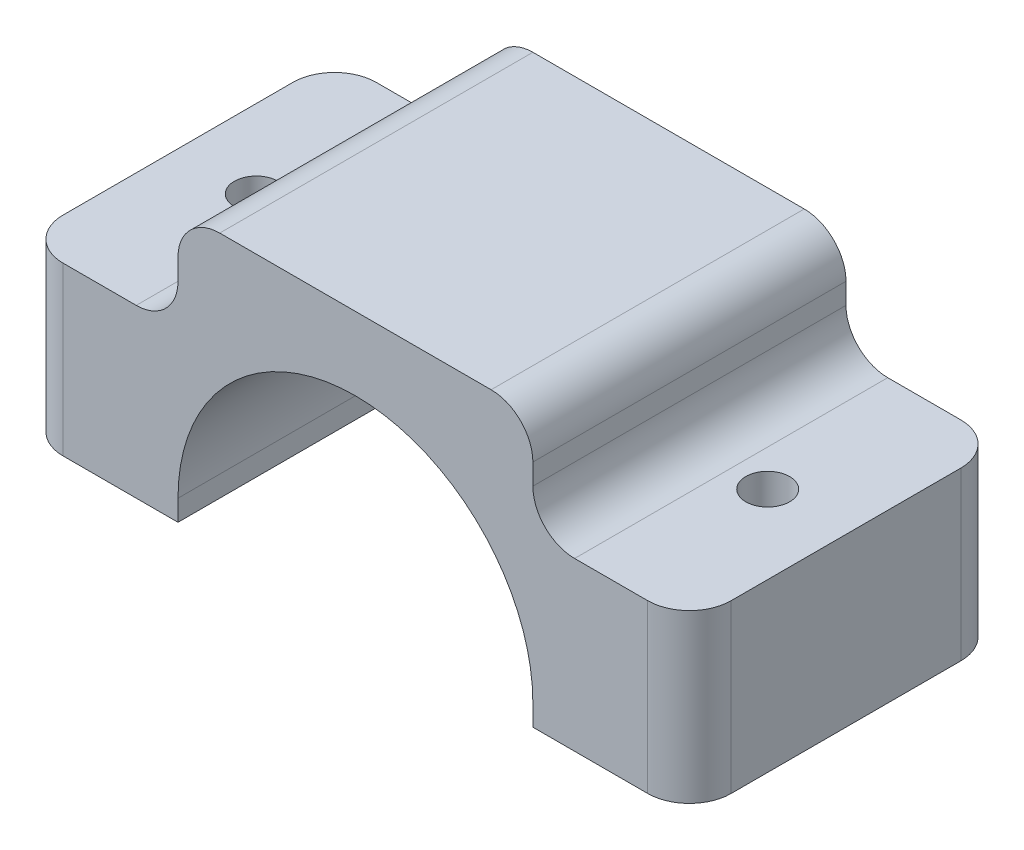
ISO-10303-21;
HEADER;
FILE_DESCRIPTION(('STEP AP214'),'2;1');
FILE_NAME('part.step','',(''),(''),'','','');
FILE_SCHEMA(('AUTOMOTIVE_DESIGN { 1 0 10303 214 1 1 1 1 }'));
ENDSEC;
DATA;
#1=APPLICATION_CONTEXT('core data for automotive mechanical design processes');
#2=APPLICATION_PROTOCOL_DEFINITION('international standard','automotive_design',2000,#1);
#3=PRODUCT_CONTEXT('',#1,'mechanical');
#4=PRODUCT('Part','Part','',(#3));
#5=PRODUCT_RELATED_PRODUCT_CATEGORY('part','',(#4));
#6=PRODUCT_DEFINITION_FORMATION('','',#4);
#7=PRODUCT_DEFINITION_CONTEXT('part definition',#1,'design');
#8=PRODUCT_DEFINITION('design','',#6,#7);
#9=PRODUCT_DEFINITION_SHAPE('','',#8);
#10=(LENGTH_UNIT() NAMED_UNIT(*) SI_UNIT(.MILLI.,.METRE.));
#11=(NAMED_UNIT(*) PLANE_ANGLE_UNIT() SI_UNIT($,.RADIAN.));
#12=(NAMED_UNIT(*) SI_UNIT($,.STERADIAN.) SOLID_ANGLE_UNIT());
#13=UNCERTAINTY_MEASURE_WITH_UNIT(LENGTH_MEASURE(1.E-05),#10,'distance_accuracy_value','');
#14=(GEOMETRIC_REPRESENTATION_CONTEXT(3) GLOBAL_UNCERTAINTY_ASSIGNED_CONTEXT((#13)) GLOBAL_UNIT_ASSIGNED_CONTEXT((#10,
#11,#12)) REPRESENTATION_CONTEXT('',''));
#15=CARTESIAN_POINT('',(0.,0.,0.));
#16=DIRECTION('',(0.,0.,1.));
#17=DIRECTION('',(1.,0.,0.));
#18=AXIS2_PLACEMENT_3D('',#15,#16,#17);
#19=CARTESIAN_POINT('',(0.,12.,15.));
#20=DIRECTION('',(0.,-1.,0.));
#21=DIRECTION('',(1.,0.,0.));
#22=AXIS2_PLACEMENT_3D('',#19,#20,#21);
#23=PLANE('',#22);
#24=DIRECTION('',(-1.,0.,0.));
#25=VECTOR('',#24,1.);
#26=CARTESIAN_POINT('',(0.,12.,15.));
#27=LINE('',#26,#25);
#28=CARTESIAN_POINT('',(6.5,12.,15.));
#29=VERTEX_POINT('',#28);
#30=CARTESIAN_POINT('',(-6.5,12.,15.));
#31=VERTEX_POINT('',#30);
#32=EDGE_CURVE('E283',#29,#31,#27,.T.);
#33=ORIENTED_EDGE('',*,*,#32,.F.);
#34=DIRECTION('',(0.,0.,-1.));
#35=VECTOR('',#34,1.);
#36=CARTESIAN_POINT('',(6.5,12.,0.));
#37=LINE('',#36,#35);
#38=CARTESIAN_POINT('',(6.5,12.,0.));
#39=VERTEX_POINT('',#38);
#40=EDGE_CURVE('E324',#29,#39,#37,.T.);
#41=ORIENTED_EDGE('',*,*,#40,.T.);
#42=DIRECTION('',(-1.,0.,0.));
#43=VECTOR('',#42,1.);
#44=CARTESIAN_POINT('',(0.,12.,0.));
#45=LINE('',#44,#43);
#46=CARTESIAN_POINT('',(-6.5,12.,0.));
#47=VERTEX_POINT('',#46);
#48=EDGE_CURVE('E284',#39,#47,#45,.T.);
#49=ORIENTED_EDGE('',*,*,#48,.T.);
#50=DIRECTION('',(0.,0.,1.));
#51=VECTOR('',#50,1.);
#52=CARTESIAN_POINT('',(-6.5,12.,15.));
#53=LINE('',#52,#51);
#54=EDGE_CURVE('E321',#47,#31,#53,.T.);
#55=ORIENTED_EDGE('',*,*,#54,.T.);
#56=EDGE_LOOP('',(#33,#41,#49,#55));
#57=FACE_BOUND('',#56,.T.);
#58=ADVANCED_FACE('F37',(#57),#23,.F.);
#59=CARTESIAN_POINT('',(0.,0.,15.));
#60=DIRECTION('',(0.,0.,-1.));
#61=DIRECTION('',(-1.,0.,0.));
#62=AXIS2_PLACEMENT_3D('',#59,#60,#61);
#63=CYLINDRICAL_SURFACE('',#62,8.5);
#64=CARTESIAN_POINT('',(0.,0.,0.));
#65=DIRECTION('',(0.,0.,1.));
#66=DIRECTION('',(1.,0.,0.));
#67=AXIS2_PLACEMENT_3D('',#64,#65,#66);
#68=CIRCLE('',#67,8.5);
#69=CARTESIAN_POINT('',(8.5,0.,0.));
#70=VERTEX_POINT('',#69);
#71=CARTESIAN_POINT('',(-8.5,0.,0.));
#72=VERTEX_POINT('',#71);
#73=EDGE_CURVE('E280',#70,#72,#68,.T.);
#74=ORIENTED_EDGE('',*,*,#73,.F.);
#75=DIRECTION('',(0.,0.,-1.));
#76=VECTOR('',#75,1.);
#77=CARTESIAN_POINT('',(8.5,0.,15.));
#78=LINE('',#77,#76);
#79=CARTESIAN_POINT('',(8.5,0.,15.));
#80=VERTEX_POINT('',#79);
#81=EDGE_CURVE('E292',#80,#70,#78,.T.);
#82=ORIENTED_EDGE('',*,*,#81,.F.);
#83=CARTESIAN_POINT('',(0.,0.,15.));
#84=DIRECTION('',(0.,0.,1.));
#85=DIRECTION('',(1.,0.,0.));
#86=AXIS2_PLACEMENT_3D('',#83,#84,#85);
#87=CIRCLE('',#86,8.5);
#88=CARTESIAN_POINT('',(-8.5,0.,15.));
#89=VERTEX_POINT('',#88);
#90=EDGE_CURVE('E281',#80,#89,#87,.T.);
#91=ORIENTED_EDGE('',*,*,#90,.T.);
#92=DIRECTION('',(0.,0.,-1.));
#93=VECTOR('',#92,1.);
#94=CARTESIAN_POINT('',(-8.5,0.,15.));
#95=LINE('',#94,#93);
#96=EDGE_CURVE('E286',#89,#72,#95,.T.);
#97=ORIENTED_EDGE('',*,*,#96,.T.);
#98=EDGE_LOOP('',(#74,#82,#91,#97));
#99=FACE_BOUND('',#98,.T.);
#100=ADVANCED_FACE('F390',(#99),#63,.F.);
#101=CARTESIAN_POINT('',(16.,0.,15.));
#102=DIRECTION('',(-1.,0.,0.));
#103=DIRECTION('',(0.,0.,1.));
#104=AXIS2_PLACEMENT_3D('',#101,#102,#103);
#105=PLANE('',#104);
#106=DIRECTION('',(0.,1.,0.));
#107=VECTOR('',#106,1.);
#108=CARTESIAN_POINT('',(16.,0.,2.));
#109=LINE('',#108,#107);
#110=CARTESIAN_POINT('',(16.,-1.00000000000001,2.));
#111=VERTEX_POINT('',#110);
#112=CARTESIAN_POINT('',(16.,7.,2.));
#113=VERTEX_POINT('',#112);
#114=EDGE_CURVE('E175',#111,#113,#109,.T.);
#115=ORIENTED_EDGE('',*,*,#114,.T.);
#116=DIRECTION('',(0.,0.,1.));
#117=VECTOR('',#116,1.);
#118=CARTESIAN_POINT('',(16.,7.,15.));
#119=LINE('',#118,#117);
#120=CARTESIAN_POINT('',(16.,7.,13.));
#121=VERTEX_POINT('',#120);
#122=EDGE_CURVE('E267',#113,#121,#119,.T.);
#123=ORIENTED_EDGE('',*,*,#122,.T.);
#124=DIRECTION('',(0.,1.,0.));
#125=VECTOR('',#124,1.);
#126=CARTESIAN_POINT('',(16.,0.,13.));
#127=LINE('',#126,#125);
#128=CARTESIAN_POINT('',(16.,-1.00000000000001,13.));
#129=VERTEX_POINT('',#128);
#130=EDGE_CURVE('E185',#121,#129,#127,.F.);
#131=ORIENTED_EDGE('',*,*,#130,.T.);
#132=DIRECTION('',(0.,0.,1.));
#133=VECTOR('',#132,1.);
#134=CARTESIAN_POINT('',(16.,-1.00000000000001,2.));
#135=LINE('',#134,#133);
#136=EDGE_CURVE('E189',#111,#129,#135,.T.);
#137=ORIENTED_EDGE('',*,*,#136,.F.);
#138=EDGE_LOOP('',(#115,#123,#131,#137));
#139=FACE_BOUND('',#138,.T.);
#140=ADVANCED_FACE('F190',(#139),#105,.F.);
#141=CARTESIAN_POINT('',(-16.,0.,15.));
#142=DIRECTION('',(-1.,0.,0.));
#143=DIRECTION('',(0.,0.,1.));
#144=AXIS2_PLACEMENT_3D('',#141,#142,#143);
#145=PLANE('',#144);
#146=DIRECTION('',(0.,0.,-1.));
#147=VECTOR('',#146,1.);
#148=CARTESIAN_POINT('',(-16.,6.99999999999999,15.));
#149=LINE('',#148,#147);
#150=CARTESIAN_POINT('',(-16.,6.99999999999999,13.));
#151=VERTEX_POINT('',#150);
#152=CARTESIAN_POINT('',(-16.,6.99999999999999,2.));
#153=VERTEX_POINT('',#152);
#154=EDGE_CURVE('E248',#151,#153,#149,.T.);
#155=ORIENTED_EDGE('',*,*,#154,.T.);
#156=DIRECTION('',(0.,1.,0.));
#157=VECTOR('',#156,1.);
#158=CARTESIAN_POINT('',(-16.,0.,2.));
#159=LINE('',#158,#157);
#160=CARTESIAN_POINT('',(-16.,-0.999999999999992,2.));
#161=VERTEX_POINT('',#160);
#162=EDGE_CURVE('E303',#153,#161,#159,.F.);
#163=ORIENTED_EDGE('',*,*,#162,.T.);
#164=DIRECTION('',(0.,0.,-1.));
#165=VECTOR('',#164,1.);
#166=CARTESIAN_POINT('',(-16.,-0.999999999999992,13.));
#167=LINE('',#166,#165);
#168=CARTESIAN_POINT('',(-16.,-0.999999999999992,13.));
#169=VERTEX_POINT('',#168);
#170=EDGE_CURVE('E225',#169,#161,#167,.T.);
#171=ORIENTED_EDGE('',*,*,#170,.F.);
#172=DIRECTION('',(0.,1.,0.));
#173=VECTOR('',#172,1.);
#174=CARTESIAN_POINT('',(-16.,0.,13.));
#175=LINE('',#174,#173);
#176=EDGE_CURVE('E300',#169,#151,#175,.T.);
#177=ORIENTED_EDGE('',*,*,#176,.T.);
#178=EDGE_LOOP('',(#155,#163,#171,#177));
#179=FACE_BOUND('',#178,.T.);
#180=ADVANCED_FACE('F409',(#179),#145,.T.);
#181=CARTESIAN_POINT('',(0.,0.,15.));
#182=DIRECTION('',(0.,0.,1.));
#183=DIRECTION('',(1.,0.,0.));
#184=AXIS2_PLACEMENT_3D('',#181,#182,#183);
#185=PLANE('',#184);
#186=DIRECTION('',(0.,1.,0.));
#187=VECTOR('',#186,1.);
#188=CARTESIAN_POINT('',(8.5,7.,15.));
#189=LINE('',#188,#187);
#190=CARTESIAN_POINT('',(8.5,9.,15.));
#191=VERTEX_POINT('',#190);
#192=CARTESIAN_POINT('',(8.5,9.99999999999999,15.));
#193=VERTEX_POINT('',#192);
#194=EDGE_CURVE('E272',#191,#193,#189,.T.);
#195=ORIENTED_EDGE('',*,*,#194,.T.);
#196=CARTESIAN_POINT('',(6.5,9.99999999999999,15.));
#197=DIRECTION('',(0.,0.,1.));
#198=DIRECTION('',(1.,0.,0.));
#199=AXIS2_PLACEMENT_3D('',#196,#197,#198);
#200=CIRCLE('',#199,2.);
#201=EDGE_CURVE('E332',#193,#29,#200,.T.);
#202=ORIENTED_EDGE('',*,*,#201,.T.);
#203=ORIENTED_EDGE('',*,*,#32,.T.);
#204=CARTESIAN_POINT('',(-6.5,9.99999999999999,15.));
#205=DIRECTION('',(0.,0.,1.));
#206=DIRECTION('',(1.,0.,0.));
#207=AXIS2_PLACEMENT_3D('',#204,#205,#206);
#208=CIRCLE('',#207,2.);
#209=CARTESIAN_POINT('',(-8.5,9.99999999999999,15.));
#210=VERTEX_POINT('',#209);
#211=EDGE_CURVE('E52',#31,#210,#208,.T.);
#212=ORIENTED_EDGE('',*,*,#211,.T.);
#213=DIRECTION('',(0.,1.,0.));
#214=VECTOR('',#213,1.);
#215=CARTESIAN_POINT('',(-8.5,6.99999999999999,15.));
#216=LINE('',#215,#214);
#217=CARTESIAN_POINT('',(-8.5,8.99999999999999,15.));
#218=VERTEX_POINT('',#217);
#219=EDGE_CURVE('E257',#218,#210,#216,.T.);
#220=ORIENTED_EDGE('',*,*,#219,.F.);
#221=CARTESIAN_POINT('',(-10.5,8.99999999999999,15.));
#222=DIRECTION('',(0.,0.,1.));
#223=DIRECTION('',(1.,0.,0.));
#224=AXIS2_PLACEMENT_3D('',#221,#222,#223);
#225=CIRCLE('',#224,2.);
#226=CARTESIAN_POINT('',(-10.5,6.99999999999999,15.));
#227=VERTEX_POINT('',#226);
#228=EDGE_CURVE('E45',#218,#227,#225,.F.);
#229=ORIENTED_EDGE('',*,*,#228,.T.);
#230=DIRECTION('',(-1.,0.,0.));
#231=VECTOR('',#230,1.);
#232=CARTESIAN_POINT('',(0.,6.99999999999999,15.));
#233=LINE('',#232,#231);
#234=CARTESIAN_POINT('',(-14.,6.99999999999999,15.));
#235=VERTEX_POINT('',#234);
#236=EDGE_CURVE('E255',#227,#235,#233,.T.);
#237=ORIENTED_EDGE('',*,*,#236,.T.);
#238=DIRECTION('',(0.,1.,0.));
#239=VECTOR('',#238,1.);
#240=CARTESIAN_POINT('',(-14.,0.,15.));
#241=LINE('',#240,#239);
#242=CARTESIAN_POINT('',(-14.,-0.999999999999993,15.));
#243=VERTEX_POINT('',#242);
#244=EDGE_CURVE('E186',#235,#243,#241,.F.);
#245=ORIENTED_EDGE('',*,*,#244,.T.);
#246=DIRECTION('',(-1.,0.,0.));
#247=VECTOR('',#246,1.);
#248=CARTESIAN_POINT('',(-8.5,-0.999999999999996,15.));
#249=LINE('',#248,#247);
#250=CARTESIAN_POINT('',(-8.5,-0.999999999999996,15.));
#251=VERTEX_POINT('',#250);
#252=EDGE_CURVE('E235',#251,#243,#249,.T.);
#253=ORIENTED_EDGE('',*,*,#252,.F.);
#254=DIRECTION('',(0.,1.,0.));
#255=VECTOR('',#254,1.);
#256=CARTESIAN_POINT('',(-8.5,-0.999999999999996,15.));
#257=LINE('',#256,#255);
#258=EDGE_CURVE('E238',#251,#89,#257,.T.);
#259=ORIENTED_EDGE('',*,*,#258,.T.);
#260=ORIENTED_EDGE('',*,*,#90,.F.);
#261=DIRECTION('',(0.,1.,0.));
#262=VECTOR('',#261,1.);
#263=CARTESIAN_POINT('',(8.5,-1.,15.));
#264=LINE('',#263,#262);
#265=CARTESIAN_POINT('',(8.5,-1.,15.));
#266=VERTEX_POINT('',#265);
#267=EDGE_CURVE('E216',#266,#80,#264,.T.);
#268=ORIENTED_EDGE('',*,*,#267,.F.);
#269=DIRECTION('',(-1.,0.,0.));
#270=VECTOR('',#269,1.);
#271=CARTESIAN_POINT('',(14.,-1.00000000000001,15.));
#272=LINE('',#271,#270);
#273=CARTESIAN_POINT('',(14.,-1.00000000000001,15.));
#274=VERTEX_POINT('',#273);
#275=EDGE_CURVE('E208',#274,#266,#272,.T.);
#276=ORIENTED_EDGE('',*,*,#275,.F.);
#277=DIRECTION('',(0.,1.,0.));
#278=VECTOR('',#277,1.);
#279=CARTESIAN_POINT('',(14.,12.,15.));
#280=LINE('',#279,#278);
#281=CARTESIAN_POINT('',(14.,7.,15.));
#282=VERTEX_POINT('',#281);
#283=EDGE_CURVE('E305',#274,#282,#280,.T.);
#284=ORIENTED_EDGE('',*,*,#283,.T.);
#285=DIRECTION('',(-1.,0.,0.));
#286=VECTOR('',#285,1.);
#287=CARTESIAN_POINT('',(0.,6.99999999999999,15.));
#288=LINE('',#287,#286);
#289=CARTESIAN_POINT('',(10.5,7.,15.));
#290=VERTEX_POINT('',#289);
#291=EDGE_CURVE('E269',#282,#290,#288,.T.);
#292=ORIENTED_EDGE('',*,*,#291,.T.);
#293=CARTESIAN_POINT('',(10.5,9.,15.));
#294=DIRECTION('',(0.,0.,1.));
#295=DIRECTION('',(1.,0.,0.));
#296=AXIS2_PLACEMENT_3D('',#293,#294,#295);
#297=CIRCLE('',#296,2.);
#298=EDGE_CURVE('E342',#290,#191,#297,.F.);
#299=ORIENTED_EDGE('',*,*,#298,.T.);
#300=EDGE_LOOP('',(#195,#202,#203,#212,#220,#229,#237,#245,#253,#259,#260,#268,#276,#284,#292,#299));
#301=FACE_BOUND('',#300,.T.);
#302=ADVANCED_FACE('F344',(#301),#185,.T.);
#303=CARTESIAN_POINT('',(0.,0.,0.));
#304=DIRECTION('',(0.,0.,1.));
#305=DIRECTION('',(1.,0.,0.));
#306=AXIS2_PLACEMENT_3D('',#303,#304,#305);
#307=PLANE('',#306);
#308=ORIENTED_EDGE('',*,*,#48,.F.);
#309=CARTESIAN_POINT('',(6.5,9.99999999999999,0.));
#310=DIRECTION('',(0.,0.,1.));
#311=DIRECTION('',(1.,0.,0.));
#312=AXIS2_PLACEMENT_3D('',#309,#310,#311);
#313=CIRCLE('',#312,2.);
#314=CARTESIAN_POINT('',(8.5,9.99999999999999,0.));
#315=VERTEX_POINT('',#314);
#316=EDGE_CURVE('E329',#39,#315,#313,.F.);
#317=ORIENTED_EDGE('',*,*,#316,.T.);
#318=DIRECTION('',(0.,1.,0.));
#319=VECTOR('',#318,1.);
#320=CARTESIAN_POINT('',(8.5,7.,0.));
#321=LINE('',#320,#319);
#322=CARTESIAN_POINT('',(8.5,9.,0.));
#323=VERTEX_POINT('',#322);
#324=EDGE_CURVE('E249',#323,#315,#321,.T.);
#325=ORIENTED_EDGE('',*,*,#324,.F.);
#326=CARTESIAN_POINT('',(10.5,9.,0.));
#327=DIRECTION('',(0.,0.,1.));
#328=DIRECTION('',(1.,0.,0.));
#329=AXIS2_PLACEMENT_3D('',#326,#327,#328);
#330=CIRCLE('',#329,2.);
#331=CARTESIAN_POINT('',(10.5,7.,0.));
#332=VERTEX_POINT('',#331);
#333=EDGE_CURVE('E340',#323,#332,#330,.T.);
#334=ORIENTED_EDGE('',*,*,#333,.T.);
#335=DIRECTION('',(1.,0.,0.));
#336=VECTOR('',#335,1.);
#337=CARTESIAN_POINT('',(0.,6.99999999999999,0.));
#338=LINE('',#337,#336);
#339=CARTESIAN_POINT('',(14.,7.,0.));
#340=VERTEX_POINT('',#339);
#341=EDGE_CURVE('E265',#332,#340,#338,.T.);
#342=ORIENTED_EDGE('',*,*,#341,.T.);
#343=DIRECTION('',(0.,1.,0.));
#344=VECTOR('',#343,1.);
#345=CARTESIAN_POINT('',(14.,0.,0.));
#346=LINE('',#345,#344);
#347=CARTESIAN_POINT('',(14.,-1.00000000000001,0.));
#348=VERTEX_POINT('',#347);
#349=EDGE_CURVE('E295',#340,#348,#346,.F.);
#350=ORIENTED_EDGE('',*,*,#349,.T.);
#351=DIRECTION('',(1.,0.,0.));
#352=VECTOR('',#351,1.);
#353=CARTESIAN_POINT('',(8.5,-1.,0.));
#354=LINE('',#353,#352);
#355=CARTESIAN_POINT('',(8.5,-1.,0.));
#356=VERTEX_POINT('',#355);
#357=EDGE_CURVE('E201',#356,#348,#354,.T.);
#358=ORIENTED_EDGE('',*,*,#357,.F.);
#359=DIRECTION('',(0.,1.,0.));
#360=VECTOR('',#359,1.);
#361=CARTESIAN_POINT('',(8.5,-1.,0.));
#362=LINE('',#361,#360);
#363=EDGE_CURVE('E213',#356,#70,#362,.T.);
#364=ORIENTED_EDGE('',*,*,#363,.T.);
#365=ORIENTED_EDGE('',*,*,#73,.T.);
#366=DIRECTION('',(0.,1.,0.));
#367=VECTOR('',#366,1.);
#368=CARTESIAN_POINT('',(-8.5,-0.999999999999996,0.));
#369=LINE('',#368,#367);
#370=CARTESIAN_POINT('',(-8.5,-0.999999999999996,0.));
#371=VERTEX_POINT('',#370);
#372=EDGE_CURVE('E241',#371,#72,#369,.T.);
#373=ORIENTED_EDGE('',*,*,#372,.F.);
#374=DIRECTION('',(1.,0.,0.));
#375=VECTOR('',#374,1.);
#376=CARTESIAN_POINT('',(-14.,-0.999999999999993,0.));
#377=LINE('',#376,#375);
#378=CARTESIAN_POINT('',(-14.,-0.999999999999993,0.));
#379=VERTEX_POINT('',#378);
#380=EDGE_CURVE('E231',#379,#371,#377,.T.);
#381=ORIENTED_EDGE('',*,*,#380,.F.);
#382=DIRECTION('',(0.,1.,0.));
#383=VECTOR('',#382,1.);
#384=CARTESIAN_POINT('',(-14.,12.,0.));
#385=LINE('',#384,#383);
#386=CARTESIAN_POINT('',(-14.,6.99999999999999,0.));
#387=VERTEX_POINT('',#386);
#388=EDGE_CURVE('E297',#379,#387,#385,.T.);
#389=ORIENTED_EDGE('',*,*,#388,.T.);
#390=DIRECTION('',(1.,0.,0.));
#391=VECTOR('',#390,1.);
#392=CARTESIAN_POINT('',(0.,6.99999999999999,0.));
#393=LINE('',#392,#391);
#394=CARTESIAN_POINT('',(-10.5,6.99999999999999,0.));
#395=VERTEX_POINT('',#394);
#396=EDGE_CURVE('E252',#387,#395,#393,.T.);
#397=ORIENTED_EDGE('',*,*,#396,.T.);
#398=CARTESIAN_POINT('',(-10.5,8.99999999999999,0.));
#399=DIRECTION('',(0.,0.,1.));
#400=DIRECTION('',(1.,0.,0.));
#401=AXIS2_PLACEMENT_3D('',#398,#399,#400);
#402=CIRCLE('',#401,2.);
#403=CARTESIAN_POINT('',(-8.5,8.99999999999999,0.));
#404=VERTEX_POINT('',#403);
#405=EDGE_CURVE('E11',#395,#404,#402,.T.);
#406=ORIENTED_EDGE('',*,*,#405,.T.);
#407=DIRECTION('',(0.,1.,0.));
#408=VECTOR('',#407,1.);
#409=CARTESIAN_POINT('',(-8.5,6.99999999999999,0.));
#410=LINE('',#409,#408);
#411=CARTESIAN_POINT('',(-8.5,9.99999999999999,0.));
#412=VERTEX_POINT('',#411);
#413=EDGE_CURVE('E259',#404,#412,#410,.T.);
#414=ORIENTED_EDGE('',*,*,#413,.T.);
#415=CARTESIAN_POINT('',(-6.5,9.99999999999999,0.));
#416=DIRECTION('',(0.,0.,1.));
#417=DIRECTION('',(1.,0.,0.));
#418=AXIS2_PLACEMENT_3D('',#415,#416,#417);
#419=CIRCLE('',#418,2.);
#420=EDGE_CURVE('E327',#412,#47,#419,.F.);
#421=ORIENTED_EDGE('',*,*,#420,.T.);
#422=EDGE_LOOP('',(#308,#317,#325,#334,#342,#350,#358,#364,#365,#373,#381,#389,#397,#406,#414,#421));
#423=FACE_BOUND('',#422,.T.);
#424=ADVANCED_FACE('F354',(#423),#307,.F.);
#425=CARTESIAN_POINT('',(-12.25,12.,7.5));
#426=DIRECTION('',(0.,-1.,0.));
#427=DIRECTION('',(1.,0.,0.));
#428=AXIS2_PLACEMENT_3D('',#425,#426,#427);
#429=CYLINDRICAL_SURFACE('',#428,1.05);
#430=CARTESIAN_POINT('',(-12.25,6.99999999999999,7.5));
#431=DIRECTION('',(0.,-1.,0.));
#432=DIRECTION('',(1.,0.,0.));
#433=AXIS2_PLACEMENT_3D('',#430,#431,#432);
#434=CIRCLE('',#433,1.05);
#435=CARTESIAN_POINT('',(-11.2,6.99999999999999,7.5));
#436=VERTEX_POINT('',#435);
#437=EDGE_CURVE('E245',#436,#436,#434,.T.);
#438=ORIENTED_EDGE('',*,*,#437,.F.);
#439=EDGE_LOOP('',(#438));
#440=FACE_BOUND('',#439,.T.);
#441=CARTESIAN_POINT('',(-12.25,-0.999999999999994,7.5));
#442=DIRECTION('',(0.,-1.,0.));
#443=DIRECTION('',(1.,0.,0.));
#444=AXIS2_PLACEMENT_3D('',#441,#442,#443);
#445=CIRCLE('',#444,1.05);
#446=CARTESIAN_POINT('',(-11.2,-0.999999999999994,7.5));
#447=VERTEX_POINT('',#446);
#448=EDGE_CURVE('E219',#447,#447,#445,.T.);
#449=ORIENTED_EDGE('',*,*,#448,.T.);
#450=EDGE_LOOP('',(#449));
#451=FACE_BOUND('',#450,.T.);
#452=ADVANCED_FACE('F444',(#440,#451),#429,.F.);
#453=CARTESIAN_POINT('',(12.25,12.,7.49999999999999));
#454=DIRECTION('',(0.,-1.,0.));
#455=DIRECTION('',(1.,0.,0.));
#456=AXIS2_PLACEMENT_3D('',#453,#454,#455);
#457=CYLINDRICAL_SURFACE('',#456,1.05);
#458=CARTESIAN_POINT('',(12.25,7.,7.49999999999999));
#459=DIRECTION('',(0.,-1.,0.));
#460=DIRECTION('',(1.,0.,0.));
#461=AXIS2_PLACEMENT_3D('',#458,#459,#460);
#462=CIRCLE('',#461,1.05);
#463=CARTESIAN_POINT('',(13.3,7.,7.49999999999999));
#464=VERTEX_POINT('',#463);
#465=EDGE_CURVE('E244',#464,#464,#462,.T.);
#466=ORIENTED_EDGE('',*,*,#465,.F.);
#467=EDGE_LOOP('',(#466));
#468=FACE_BOUND('',#467,.T.);
#469=CARTESIAN_POINT('',(12.25,-1.00000000000001,7.49999999999999));
#470=DIRECTION('',(0.,-1.,0.));
#471=DIRECTION('',(1.,0.,0.));
#472=AXIS2_PLACEMENT_3D('',#469,#470,#471);
#473=CIRCLE('',#472,1.05);
#474=CARTESIAN_POINT('',(13.3,-1.00000000000001,7.49999999999999));
#475=VERTEX_POINT('',#474);
#476=EDGE_CURVE('E202',#475,#475,#473,.T.);
#477=ORIENTED_EDGE('',*,*,#476,.T.);
#478=EDGE_LOOP('',(#477));
#479=FACE_BOUND('',#478,.T.);
#480=ADVANCED_FACE('F422',(#468,#479),#457,.F.);
#481=CARTESIAN_POINT('',(-14.,0.,2.));
#482=DIRECTION('',(0.,-1.,0.));
#483=DIRECTION('',(0.,0.,-1.));
#484=AXIS2_PLACEMENT_3D('',#481,#482,#483);
#485=CYLINDRICAL_SURFACE('',#484,2.);
#486=CARTESIAN_POINT('',(-14.,6.99999999999999,2.));
#487=DIRECTION('',(0.,-1.,0.));
#488=DIRECTION('',(1.,0.,0.));
#489=AXIS2_PLACEMENT_3D('',#486,#487,#488);
#490=CIRCLE('',#489,2.);
#491=EDGE_CURVE('E278',#387,#153,#490,.F.);
#492=ORIENTED_EDGE('',*,*,#491,.F.);
#493=ORIENTED_EDGE('',*,*,#388,.F.);
#494=CARTESIAN_POINT('',(-14.,-0.999999999999993,2.));
#495=DIRECTION('',(0.,-1.,0.));
#496=DIRECTION('',(1.,0.,0.));
#497=AXIS2_PLACEMENT_3D('',#494,#495,#496);
#498=CIRCLE('',#497,2.00000000000001);
#499=EDGE_CURVE('E228',#161,#379,#498,.T.);
#500=ORIENTED_EDGE('',*,*,#499,.F.);
#501=ORIENTED_EDGE('',*,*,#162,.F.);
#502=EDGE_LOOP('',(#492,#493,#500,#501));
#503=FACE_BOUND('',#502,.T.);
#504=ADVANCED_FACE('F407',(#503),#485,.T.);
#505=CARTESIAN_POINT('',(-14.,0.,13.));
#506=DIRECTION('',(0.,1.,0.));
#507=DIRECTION('',(0.,0.,1.));
#508=AXIS2_PLACEMENT_3D('',#505,#506,#507);
#509=CYLINDRICAL_SURFACE('',#508,2.);
#510=CARTESIAN_POINT('',(-14.,6.99999999999999,13.));
#511=DIRECTION('',(0.,-1.,0.));
#512=DIRECTION('',(1.,0.,0.));
#513=AXIS2_PLACEMENT_3D('',#510,#511,#512);
#514=CIRCLE('',#513,2.);
#515=EDGE_CURVE('E311',#151,#235,#514,.F.);
#516=ORIENTED_EDGE('',*,*,#515,.F.);
#517=ORIENTED_EDGE('',*,*,#176,.F.);
#518=CARTESIAN_POINT('',(-14.,-0.999999999999993,13.));
#519=DIRECTION('',(0.,-1.,0.));
#520=DIRECTION('',(1.,0.,0.));
#521=AXIS2_PLACEMENT_3D('',#518,#519,#520);
#522=CIRCLE('',#521,2.);
#523=EDGE_CURVE('E222',#243,#169,#522,.T.);
#524=ORIENTED_EDGE('',*,*,#523,.F.);
#525=ORIENTED_EDGE('',*,*,#244,.F.);
#526=EDGE_LOOP('',(#516,#517,#524,#525));
#527=FACE_BOUND('',#526,.T.);
#528=ADVANCED_FACE('F412',(#527),#509,.T.);
#529=CARTESIAN_POINT('',(14.,0.,13.));
#530=DIRECTION('',(0.,-1.,0.));
#531=DIRECTION('',(0.,0.,-1.));
#532=AXIS2_PLACEMENT_3D('',#529,#530,#531);
#533=CYLINDRICAL_SURFACE('',#532,2.);
#534=CARTESIAN_POINT('',(14.,7.,13.));
#535=DIRECTION('',(0.,-1.,0.));
#536=DIRECTION('',(1.,0.,0.));
#537=AXIS2_PLACEMENT_3D('',#534,#535,#536);
#538=CIRCLE('',#537,2.);
#539=EDGE_CURVE('E262',#282,#121,#538,.F.);
#540=ORIENTED_EDGE('',*,*,#539,.F.);
#541=ORIENTED_EDGE('',*,*,#283,.F.);
#542=CARTESIAN_POINT('',(14.,-1.00000000000001,13.));
#543=DIRECTION('',(0.,-1.,0.));
#544=DIRECTION('',(1.,0.,0.));
#545=AXIS2_PLACEMENT_3D('',#542,#543,#544);
#546=CIRCLE('',#545,2.);
#547=EDGE_CURVE('E195',#129,#274,#546,.T.);
#548=ORIENTED_EDGE('',*,*,#547,.F.);
#549=ORIENTED_EDGE('',*,*,#130,.F.);
#550=EDGE_LOOP('',(#540,#541,#548,#549));
#551=FACE_BOUND('',#550,.T.);
#552=ADVANCED_FACE('F414',(#551),#533,.T.);
#553=CARTESIAN_POINT('',(14.,0.,2.));
#554=DIRECTION('',(0.,1.,0.));
#555=DIRECTION('',(0.,0.,1.));
#556=AXIS2_PLACEMENT_3D('',#553,#554,#555);
#557=CYLINDRICAL_SURFACE('',#556,2.);
#558=CARTESIAN_POINT('',(14.,7.,2.));
#559=DIRECTION('',(0.,-1.,0.));
#560=DIRECTION('',(1.,0.,0.));
#561=AXIS2_PLACEMENT_3D('',#558,#559,#560);
#562=CIRCLE('',#561,2.);
#563=EDGE_CURVE('E182',#113,#340,#562,.F.);
#564=ORIENTED_EDGE('',*,*,#563,.F.);
#565=ORIENTED_EDGE('',*,*,#114,.F.);
#566=CARTESIAN_POINT('',(14.,-1.00000000000001,2.));
#567=DIRECTION('',(0.,-1.,0.));
#568=DIRECTION('',(1.,0.,0.));
#569=AXIS2_PLACEMENT_3D('',#566,#567,#568);
#570=CIRCLE('',#569,2.);
#571=EDGE_CURVE('E180',#348,#111,#570,.T.);
#572=ORIENTED_EDGE('',*,*,#571,.F.);
#573=ORIENTED_EDGE('',*,*,#349,.F.);
#574=EDGE_LOOP('',(#564,#565,#572,#573));
#575=FACE_BOUND('',#574,.T.);
#576=ADVANCED_FACE('F177',(#575),#557,.T.);
#577=CARTESIAN_POINT('',(0.,6.99999999999999,0.));
#578=DIRECTION('',(0.,-1.,0.));
#579=DIRECTION('',(1.,0.,0.));
#580=AXIS2_PLACEMENT_3D('',#577,#578,#579);
#581=PLANE('',#580);
#582=ORIENTED_EDGE('',*,*,#341,.F.);
#583=DIRECTION('',(0.,0.,-1.));
#584=VECTOR('',#583,1.);
#585=CARTESIAN_POINT('',(10.5,7.,0.));
#586=LINE('',#585,#584);
#587=EDGE_CURVE('E319',#332,#290,#586,.F.);
#588=ORIENTED_EDGE('',*,*,#587,.T.);
#589=ORIENTED_EDGE('',*,*,#291,.F.);
#590=ORIENTED_EDGE('',*,*,#539,.T.);
#591=ORIENTED_EDGE('',*,*,#122,.F.);
#592=ORIENTED_EDGE('',*,*,#563,.T.);
#593=EDGE_LOOP('',(#582,#588,#589,#590,#591,#592));
#594=FACE_BOUND('',#593,.T.);
#595=ORIENTED_EDGE('',*,*,#465,.T.);
#596=EDGE_LOOP('',(#595));
#597=FACE_BOUND('',#596,.T.);
#598=ADVANCED_FACE('F380',(#594,#597),#581,.F.);
#599=CARTESIAN_POINT('',(8.5,7.,15.));
#600=DIRECTION('',(1.,0.,0.));
#601=DIRECTION('',(0.,1.,0.));
#602=AXIS2_PLACEMENT_3D('',#599,#600,#601);
#603=PLANE('',#602);
#604=ORIENTED_EDGE('',*,*,#194,.F.);
#605=DIRECTION('',(0.,0.,-1.));
#606=VECTOR('',#605,1.);
#607=CARTESIAN_POINT('',(8.5,9.,15.));
#608=LINE('',#607,#606);
#609=EDGE_CURVE('E316',#191,#323,#608,.T.);
#610=ORIENTED_EDGE('',*,*,#609,.T.);
#611=ORIENTED_EDGE('',*,*,#324,.T.);
#612=DIRECTION('',(0.,0.,-1.));
#613=VECTOR('',#612,1.);
#614=CARTESIAN_POINT('',(8.5,9.99999999999999,15.));
#615=LINE('',#614,#613);
#616=EDGE_CURVE('E314',#315,#193,#615,.F.);
#617=ORIENTED_EDGE('',*,*,#616,.T.);
#618=EDGE_LOOP('',(#604,#610,#611,#617));
#619=FACE_BOUND('',#618,.T.);
#620=ADVANCED_FACE('F372',(#619),#603,.T.);
#621=CARTESIAN_POINT('',(0.,6.99999999999999,0.));
#622=DIRECTION('',(0.,-1.,0.));
#623=DIRECTION('',(1.,0.,0.));
#624=AXIS2_PLACEMENT_3D('',#621,#622,#623);
#625=PLANE('',#624);
#626=ORIENTED_EDGE('',*,*,#236,.F.);
#627=DIRECTION('',(0.,0.,1.));
#628=VECTOR('',#627,1.);
#629=CARTESIAN_POINT('',(-10.5,6.99999999999999,0.));
#630=LINE('',#629,#628);
#631=EDGE_CURVE('E338',#227,#395,#630,.F.);
#632=ORIENTED_EDGE('',*,*,#631,.T.);
#633=ORIENTED_EDGE('',*,*,#396,.F.);
#634=ORIENTED_EDGE('',*,*,#491,.T.);
#635=ORIENTED_EDGE('',*,*,#154,.F.);
#636=ORIENTED_EDGE('',*,*,#515,.T.);
#637=EDGE_LOOP('',(#626,#632,#633,#634,#635,#636));
#638=FACE_BOUND('',#637,.T.);
#639=ORIENTED_EDGE('',*,*,#437,.T.);
#640=EDGE_LOOP('',(#639));
#641=FACE_BOUND('',#640,.T.);
#642=ADVANCED_FACE('F346',(#638,#641),#625,.F.);
#643=CARTESIAN_POINT('',(-8.5,6.99999999999999,15.));
#644=DIRECTION('',(-1.,0.,0.));
#645=DIRECTION('',(0.,-1.,0.));
#646=AXIS2_PLACEMENT_3D('',#643,#644,#645);
#647=PLANE('',#646);
#648=ORIENTED_EDGE('',*,*,#219,.T.);
#649=DIRECTION('',(0.,0.,1.));
#650=VECTOR('',#649,1.);
#651=CARTESIAN_POINT('',(-8.5,9.99999999999999,0.));
#652=LINE('',#651,#650);
#653=EDGE_CURVE('E336',#210,#412,#652,.F.);
#654=ORIENTED_EDGE('',*,*,#653,.T.);
#655=ORIENTED_EDGE('',*,*,#413,.F.);
#656=DIRECTION('',(0.,0.,1.));
#657=VECTOR('',#656,1.);
#658=CARTESIAN_POINT('',(-8.5,8.99999999999999,15.));
#659=LINE('',#658,#657);
#660=EDGE_CURVE('E334',#404,#218,#659,.T.);
#661=ORIENTED_EDGE('',*,*,#660,.T.);
#662=EDGE_LOOP('',(#648,#654,#655,#661));
#663=FACE_BOUND('',#662,.T.);
#664=ADVANCED_FACE('F357',(#663),#647,.T.);
#665=CARTESIAN_POINT('',(10.5,9.,15.));
#666=DIRECTION('',(0.,0.,-1.));
#667=DIRECTION('',(-1.,0.,0.));
#668=AXIS2_PLACEMENT_3D('',#665,#666,#667);
#669=CYLINDRICAL_SURFACE('',#668,2.);
#670=ORIENTED_EDGE('',*,*,#298,.F.);
#671=ORIENTED_EDGE('',*,*,#587,.F.);
#672=ORIENTED_EDGE('',*,*,#333,.F.);
#673=ORIENTED_EDGE('',*,*,#609,.F.);
#674=EDGE_LOOP('',(#670,#671,#672,#673));
#675=FACE_BOUND('',#674,.T.);
#676=ADVANCED_FACE('F376',(#675),#669,.F.);
#677=CARTESIAN_POINT('',(6.5,9.99999999999999,15.));
#678=DIRECTION('',(0.,0.,1.));
#679=DIRECTION('',(1.,0.,0.));
#680=AXIS2_PLACEMENT_3D('',#677,#678,#679);
#681=CYLINDRICAL_SURFACE('',#680,2.);
#682=ORIENTED_EDGE('',*,*,#201,.F.);
#683=ORIENTED_EDGE('',*,*,#616,.F.);
#684=ORIENTED_EDGE('',*,*,#316,.F.);
#685=ORIENTED_EDGE('',*,*,#40,.F.);
#686=EDGE_LOOP('',(#682,#683,#684,#685));
#687=FACE_BOUND('',#686,.T.);
#688=ADVANCED_FACE('F367',(#687),#681,.T.);
#689=CARTESIAN_POINT('',(-6.5,9.99999999999999,15.));
#690=DIRECTION('',(0.,0.,-1.));
#691=DIRECTION('',(-1.,0.,0.));
#692=AXIS2_PLACEMENT_3D('',#689,#690,#691);
#693=CYLINDRICAL_SURFACE('',#692,2.);
#694=ORIENTED_EDGE('',*,*,#420,.F.);
#695=ORIENTED_EDGE('',*,*,#653,.F.);
#696=ORIENTED_EDGE('',*,*,#211,.F.);
#697=ORIENTED_EDGE('',*,*,#54,.F.);
#698=EDGE_LOOP('',(#694,#695,#696,#697));
#699=FACE_BOUND('',#698,.T.);
#700=ADVANCED_FACE('F360',(#699),#693,.T.);
#701=CARTESIAN_POINT('',(-10.5,8.99999999999999,15.));
#702=DIRECTION('',(0.,0.,1.));
#703=DIRECTION('',(1.,0.,0.));
#704=AXIS2_PLACEMENT_3D('',#701,#702,#703);
#705=CYLINDRICAL_SURFACE('',#704,2.);
#706=ORIENTED_EDGE('',*,*,#405,.F.);
#707=ORIENTED_EDGE('',*,*,#631,.F.);
#708=ORIENTED_EDGE('',*,*,#228,.F.);
#709=ORIENTED_EDGE('',*,*,#660,.F.);
#710=EDGE_LOOP('',(#706,#707,#708,#709));
#711=FACE_BOUND('',#710,.T.);
#712=ADVANCED_FACE('F39',(#711),#705,.F.);
#713=CARTESIAN_POINT('',(-14.,-0.999999999999993,13.));
#714=DIRECTION('',(0.,-1.,0.));
#715=DIRECTION('',(1.,0.,0.));
#716=AXIS2_PLACEMENT_3D('',#713,#714,#715);
#717=PLANE('',#716);
#718=ORIENTED_EDGE('',*,*,#523,.T.);
#719=ORIENTED_EDGE('',*,*,#170,.T.);
#720=ORIENTED_EDGE('',*,*,#499,.T.);
#721=ORIENTED_EDGE('',*,*,#380,.T.);
#722=DIRECTION('',(0.,0.,1.));
#723=VECTOR('',#722,1.);
#724=CARTESIAN_POINT('',(-8.5,-0.999999999999996,0.));
#725=LINE('',#724,#723);
#726=EDGE_CURVE('E233',#371,#251,#725,.T.);
#727=ORIENTED_EDGE('',*,*,#726,.T.);
#728=ORIENTED_EDGE('',*,*,#252,.T.);
#729=EDGE_LOOP('',(#718,#719,#720,#721,#727,#728));
#730=FACE_BOUND('',#729,.T.);
#731=ORIENTED_EDGE('',*,*,#448,.F.);
#732=EDGE_LOOP('',(#731));
#733=FACE_BOUND('',#732,.T.);
#734=ADVANCED_FACE('F400',(#730,#733),#717,.T.);
#735=CARTESIAN_POINT('',(-8.5,-0.999999999999996,0.));
#736=DIRECTION('',(-1.,0.,0.));
#737=DIRECTION('',(0.,-1.,0.));
#738=AXIS2_PLACEMENT_3D('',#735,#736,#737);
#739=PLANE('',#738);
#740=ORIENTED_EDGE('',*,*,#96,.F.);
#741=ORIENTED_EDGE('',*,*,#258,.F.);
#742=ORIENTED_EDGE('',*,*,#726,.F.);
#743=ORIENTED_EDGE('',*,*,#372,.T.);
#744=EDGE_LOOP('',(#740,#741,#742,#743));
#745=FACE_BOUND('',#744,.T.);
#746=ADVANCED_FACE('F397',(#745),#739,.F.);
#747=CARTESIAN_POINT('',(14.,-1.00000000000001,2.));
#748=DIRECTION('',(0.,-1.,0.));
#749=DIRECTION('',(1.,0.,0.));
#750=AXIS2_PLACEMENT_3D('',#747,#748,#749);
#751=PLANE('',#750);
#752=ORIENTED_EDGE('',*,*,#571,.T.);
#753=ORIENTED_EDGE('',*,*,#136,.T.);
#754=ORIENTED_EDGE('',*,*,#547,.T.);
#755=ORIENTED_EDGE('',*,*,#275,.T.);
#756=DIRECTION('',(0.,0.,-1.));
#757=VECTOR('',#756,1.);
#758=CARTESIAN_POINT('',(8.5,-1.,15.));
#759=LINE('',#758,#757);
#760=EDGE_CURVE('E210',#266,#356,#759,.T.);
#761=ORIENTED_EDGE('',*,*,#760,.T.);
#762=ORIENTED_EDGE('',*,*,#357,.T.);
#763=EDGE_LOOP('',(#752,#753,#754,#755,#761,#762));
#764=FACE_BOUND('',#763,.T.);
#765=ORIENTED_EDGE('',*,*,#476,.F.);
#766=EDGE_LOOP('',(#765));
#767=FACE_BOUND('',#766,.T.);
#768=ADVANCED_FACE('F198',(#764,#767),#751,.T.);
#769=CARTESIAN_POINT('',(8.5,-1.,15.));
#770=DIRECTION('',(1.,0.,0.));
#771=DIRECTION('',(0.,1.,0.));
#772=AXIS2_PLACEMENT_3D('',#769,#770,#771);
#773=PLANE('',#772);
#774=ORIENTED_EDGE('',*,*,#81,.T.);
#775=ORIENTED_EDGE('',*,*,#363,.F.);
#776=ORIENTED_EDGE('',*,*,#760,.F.);
#777=ORIENTED_EDGE('',*,*,#267,.T.);
#778=EDGE_LOOP('',(#774,#775,#776,#777));
#779=FACE_BOUND('',#778,.T.);
#780=ADVANCED_FACE('F386',(#779),#773,.F.);
#781=CLOSED_SHELL('',(#58,#100,#140,#180,#302,#424,#452,#480,#504,#528,#552,#576,#598,#620,#642,
#664,#676,#688,#700,#712,#734,#746,#768,#780));
#782=MANIFOLD_SOLID_BREP('B2',#781);
#783=ADVANCED_BREP_SHAPE_REPRESENTATION('',(#18,#782),#14);
#784=SHAPE_DEFINITION_REPRESENTATION(#9,#783);
ENDSEC;
END-ISO-10303-21;
